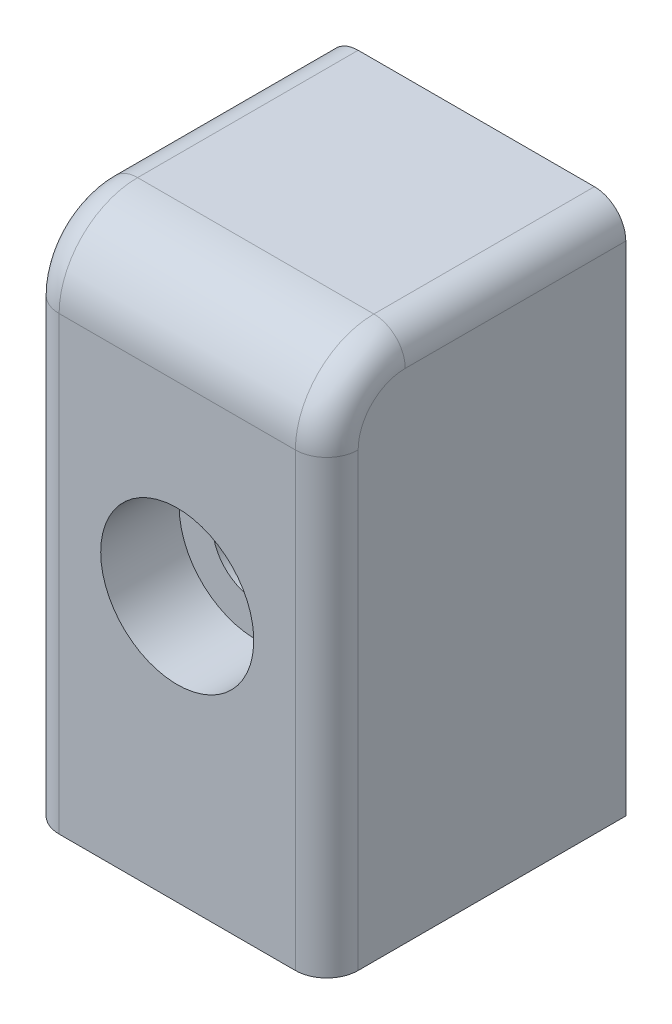
ISO-10303-21;
HEADER;
FILE_DESCRIPTION(('STEP AP214'),'2;1');
FILE_NAME('part.step','',(''),(''),'','','');
FILE_SCHEMA(('AUTOMOTIVE_DESIGN { 1 0 10303 214 1 1 1 1 }'));
ENDSEC;
DATA;
#1=APPLICATION_CONTEXT('core data for automotive mechanical design processes');
#2=APPLICATION_PROTOCOL_DEFINITION('international standard','automotive_design',2000,#1);
#3=PRODUCT_CONTEXT('',#1,'mechanical');
#4=PRODUCT('Part','Part','',(#3));
#5=PRODUCT_RELATED_PRODUCT_CATEGORY('part','',(#4));
#6=PRODUCT_DEFINITION_FORMATION('','',#4);
#7=PRODUCT_DEFINITION_CONTEXT('part definition',#1,'design');
#8=PRODUCT_DEFINITION('design','',#6,#7);
#9=PRODUCT_DEFINITION_SHAPE('','',#8);
#10=(LENGTH_UNIT() NAMED_UNIT(*) SI_UNIT(.MILLI.,.METRE.));
#11=(NAMED_UNIT(*) PLANE_ANGLE_UNIT() SI_UNIT($,.RADIAN.));
#12=(NAMED_UNIT(*) SI_UNIT($,.STERADIAN.) SOLID_ANGLE_UNIT());
#13=UNCERTAINTY_MEASURE_WITH_UNIT(LENGTH_MEASURE(1.E-05),#10,'distance_accuracy_value','');
#14=(GEOMETRIC_REPRESENTATION_CONTEXT(3) GLOBAL_UNCERTAINTY_ASSIGNED_CONTEXT((#13)) GLOBAL_UNIT_ASSIGNED_CONTEXT((#10,
#11,#12)) REPRESENTATION_CONTEXT('',''));
#15=CARTESIAN_POINT('',(0.,0.,0.));
#16=DIRECTION('',(0.,0.,1.));
#17=DIRECTION('',(1.,0.,0.));
#18=AXIS2_PLACEMENT_3D('',#15,#16,#17);
#19=CARTESIAN_POINT('',(276.487457350126,52.72,7.9993613968678));
#20=DIRECTION('',(0.,1.,0.));
#21=DIRECTION('',(1.,0.,0.));
#22=AXIS2_PLACEMENT_3D('',#19,#20,#21);
#23=PLANE('',#22);
#24=DIRECTION('',(0.,0.,1.));
#25=VECTOR('',#24,1.);
#26=CARTESIAN_POINT('',(284.012457350126,52.72,12.7618613968678));
#27=LINE('',#26,#25);
#28=CARTESIAN_POINT('',(284.012457350126,52.72,-1.5256386031322));
#29=VERTEX_POINT('',#28);
#30=CARTESIAN_POINT('',(284.012457350126,52.72,12.5243613968678));
#31=VERTEX_POINT('',#30);
#32=EDGE_CURVE('E169',#29,#31,#27,.T.);
#33=ORIENTED_EDGE('',*,*,#32,.F.);
#34=DIRECTION('',(-1.,0.,0.));
#35=VECTOR('',#34,1.);
#36=CARTESIAN_POINT('',(266.962457350126,52.72,-1.5256386031322));
#37=LINE('',#36,#35);
#38=CARTESIAN_POINT('',(268.962457350126,52.72,-1.5256386031322));
#39=VERTEX_POINT('',#38);
#40=EDGE_CURVE('E210',#29,#39,#37,.T.);
#41=ORIENTED_EDGE('',*,*,#40,.T.);
#42=DIRECTION('',(0.,0.,-1.));
#43=VECTOR('',#42,1.);
#44=CARTESIAN_POINT('',(268.962457350126,52.72,3.2368613968678));
#45=LINE('',#44,#43);
#46=CARTESIAN_POINT('',(268.962457350126,52.72,12.5243613968678));
#47=VERTEX_POINT('',#46);
#48=EDGE_CURVE('E197',#47,#39,#45,.T.);
#49=ORIENTED_EDGE('',*,*,#48,.F.);
#50=DIRECTION('',(-1.,0.,0.));
#51=VECTOR('',#50,1.);
#52=CARTESIAN_POINT('',(271.724957350126,52.72,12.5243613968678));
#53=LINE('',#52,#51);
#54=EDGE_CURVE('E186',#31,#47,#53,.T.);
#55=ORIENTED_EDGE('',*,*,#54,.F.);
#56=EDGE_LOOP('',(#33,#41,#49,#55));
#57=FACE_BOUND('',#56,.T.);
#58=ADVANCED_FACE('F17',(#57),#23,.T.);
#59=CARTESIAN_POINT('',(266.962457350126,0.,-1.5256386031322));
#60=DIRECTION('',(-1.,0.,0.));
#61=DIRECTION('',(0.,0.,1.));
#62=AXIS2_PLACEMENT_3D('',#59,#60,#61);
#63=PLANE('',#62);
#64=DIRECTION('',(0.,0.,1.));
#65=VECTOR('',#64,1.);
#66=CARTESIAN_POINT('',(266.962457350126,19.,3.2368613968678));
#67=LINE('',#66,#65);
#68=CARTESIAN_POINT('',(266.962457350126,19.,-1.5256386031322));
#69=VERTEX_POINT('',#68);
#70=CARTESIAN_POINT('',(266.962457350126,19.,15.5243613968678));
#71=VERTEX_POINT('',#70);
#72=EDGE_CURVE('E239',#69,#71,#67,.T.);
#73=ORIENTED_EDGE('',*,*,#72,.T.);
#74=DIRECTION('',(0.,-1.,0.));
#75=VECTOR('',#74,1.);
#76=CARTESIAN_POINT('',(266.962457350126,0.,15.5243613968678));
#77=LINE('',#76,#75);
#78=CARTESIAN_POINT('',(266.962457350126,47.72,15.5243613968678));
#79=VERTEX_POINT('',#78);
#80=EDGE_CURVE('E147',#79,#71,#77,.T.);
#81=ORIENTED_EDGE('',*,*,#80,.F.);
#82=CARTESIAN_POINT('',(266.962457350126,47.72,12.5243613968678));
#83=DIRECTION('',(1.,0.,0.));
#84=DIRECTION('',(0.,0.707106781186548,0.707106781186547));
#85=AXIS2_PLACEMENT_3D('',#82,#83,#84);
#86=CIRCLE('',#85,3.);
#87=CARTESIAN_POINT('',(266.962457350126,50.72,12.5243613968678));
#88=VERTEX_POINT('',#87);
#89=EDGE_CURVE('E176',#88,#79,#86,.T.);
#90=ORIENTED_EDGE('',*,*,#89,.F.);
#91=DIRECTION('',(0.,0.,1.));
#92=VECTOR('',#91,1.);
#93=CARTESIAN_POINT('',(266.962457350126,50.72,3.2368613968678));
#94=LINE('',#93,#92);
#95=CARTESIAN_POINT('',(266.962457350126,50.72,-1.5256386031322));
#96=VERTEX_POINT('',#95);
#97=EDGE_CURVE('E192',#96,#88,#94,.T.);
#98=ORIENTED_EDGE('',*,*,#97,.F.);
#99=DIRECTION('',(0.,1.,0.));
#100=VECTOR('',#99,1.);
#101=CARTESIAN_POINT('',(266.962457350126,0.,-1.5256386031322));
#102=LINE('',#101,#100);
#103=EDGE_CURVE('E204',#69,#96,#102,.T.);
#104=ORIENTED_EDGE('',*,*,#103,.F.);
#105=EDGE_LOOP('',(#73,#81,#90,#98,#104));
#106=FACE_BOUND('',#105,.T.);
#107=ADVANCED_FACE('F19',(#106),#63,.T.);
#108=CARTESIAN_POINT('',(276.487457350126,35.885,7.9993613968678));
#109=DIRECTION('',(0.,0.,-1.));
#110=DIRECTION('',(1.,0.,0.));
#111=AXIS2_PLACEMENT_3D('',#108,#109,#110);
#112=CYLINDRICAL_SURFACE('',#111,2.75);
#113=CARTESIAN_POINT('',(276.487457350126,35.885,12.5243613968678));
#114=DIRECTION('',(0.,0.,-1.));
#115=DIRECTION('',(1.,0.,0.));
#116=AXIS2_PLACEMENT_3D('',#113,#114,#115);
#117=CIRCLE('',#116,2.75);
#118=CARTESIAN_POINT('',(273.737457350126,35.885,12.5243613968678));
#119=VERTEX_POINT('',#118);
#120=EDGE_CURVE('E128',#119,#119,#117,.T.);
#121=ORIENTED_EDGE('',*,*,#120,.F.);
#122=DIRECTION('',(0.,0.,-1.));
#123=VECTOR('',#122,1.);
#124=CARTESIAN_POINT('',(273.737457350126,35.885,7.9993613968678));
#125=LINE('',#124,#123);
#126=CARTESIAN_POINT('',(273.737457350126,35.885,-1.5256386031322));
#127=VERTEX_POINT('',#126);
#128=EDGE_CURVE('E11',#119,#127,#125,.T.);
#129=ORIENTED_EDGE('',*,*,#128,.T.);
#130=CARTESIAN_POINT('',(276.487457350126,35.885,-1.5256386031322));
#131=DIRECTION('',(0.,0.,1.));
#132=DIRECTION('',(1.,0.,0.));
#133=AXIS2_PLACEMENT_3D('',#130,#131,#132);
#134=CIRCLE('',#133,2.75);
#135=EDGE_CURVE('E207',#127,#127,#134,.T.);
#136=ORIENTED_EDGE('',*,*,#135,.F.);
#137=ORIENTED_EDGE('',*,*,#128,.F.);
#138=EDGE_LOOP('',(#121,#129,#136,#137));
#139=FACE_BOUND('',#138,.T.);
#140=ADVANCED_FACE('F222',(#139),#112,.F.);
#141=CARTESIAN_POINT('',(276.487457350126,35.885,15.0243613968678));
#142=DIRECTION('',(0.,0.,-1.));
#143=DIRECTION('',(1.,0.,0.));
#144=AXIS2_PLACEMENT_3D('',#141,#142,#143);
#145=CYLINDRICAL_SURFACE('',#144,4.875);
#146=CARTESIAN_POINT('',(276.487457350126,35.885,17.5243613968678));
#147=DIRECTION('',(0.,0.,-1.));
#148=DIRECTION('',(1.,0.,0.));
#149=AXIS2_PLACEMENT_3D('',#146,#147,#148);
#150=CIRCLE('',#149,4.875);
#151=CARTESIAN_POINT('',(271.612457350126,35.885,17.5243613968678));
#152=VERTEX_POINT('',#151);
#153=EDGE_CURVE('E122',#152,#152,#150,.T.);
#154=ORIENTED_EDGE('',*,*,#153,.F.);
#155=DIRECTION('',(0.,0.,-1.));
#156=VECTOR('',#155,1.);
#157=CARTESIAN_POINT('',(271.612457350126,35.885,15.0243613968678));
#158=LINE('',#157,#156);
#159=CARTESIAN_POINT('',(271.612457350126,35.885,12.5243613968678));
#160=VERTEX_POINT('',#159);
#161=EDGE_CURVE('E30',#152,#160,#158,.T.);
#162=ORIENTED_EDGE('',*,*,#161,.T.);
#163=CARTESIAN_POINT('',(276.487457350126,35.885,12.5243613968678));
#164=DIRECTION('',(0.,0.,-1.));
#165=DIRECTION('',(1.,0.,0.));
#166=AXIS2_PLACEMENT_3D('',#163,#164,#165);
#167=CIRCLE('',#166,4.875);
#168=EDGE_CURVE('E130',#160,#160,#167,.T.);
#169=ORIENTED_EDGE('',*,*,#168,.T.);
#170=ORIENTED_EDGE('',*,*,#161,.F.);
#171=EDGE_LOOP('',(#154,#162,#169,#170));
#172=FACE_BOUND('',#171,.T.);
#173=ADVANCED_FACE('F123',(#172),#145,.F.);
#174=CARTESIAN_POINT('',(276.487457350126,35.885,12.5243613968678));
#175=DIRECTION('',(0.,0.,-1.));
#176=DIRECTION('',(0.,-1.,0.));
#177=AXIS2_PLACEMENT_3D('',#174,#175,#176);
#178=PLANE('',#177);
#179=ORIENTED_EDGE('',*,*,#120,.T.);
#180=EDGE_LOOP('',(#179));
#181=FACE_BOUND('',#180,.T.);
#182=ORIENTED_EDGE('',*,*,#168,.F.);
#183=EDGE_LOOP('',(#182));
#184=FACE_BOUND('',#183,.T.);
#185=ADVANCED_FACE('F218',(#181,#184),#178,.F.);
#186=CARTESIAN_POINT('',(286.012457350126,0.,-1.5256386031322));
#187=DIRECTION('',(0.,0.,-1.));
#188=DIRECTION('',(0.,-1.,0.));
#189=AXIS2_PLACEMENT_3D('',#186,#187,#188);
#190=PLANE('',#189);
#191=ORIENTED_EDGE('',*,*,#135,.T.);
#192=EDGE_LOOP('',(#191));
#193=FACE_BOUND('',#192,.T.);
#194=DIRECTION('',(-1.,0.,0.));
#195=VECTOR('',#194,1.);
#196=CARTESIAN_POINT('',(281.249957350126,19.,-1.5256386031322));
#197=LINE('',#196,#195);
#198=CARTESIAN_POINT('',(286.012457350126,19.,-1.5256386031322));
#199=VERTEX_POINT('',#198);
#200=EDGE_CURVE('E230',#199,#69,#197,.T.);
#201=ORIENTED_EDGE('',*,*,#200,.T.);
#202=ORIENTED_EDGE('',*,*,#103,.T.);
#203=CARTESIAN_POINT('',(268.962457350126,50.72,-1.5256386031322));
#204=DIRECTION('',(0.,0.,1.));
#205=DIRECTION('',(-0.707106781186538,0.707106781186557,0.));
#206=AXIS2_PLACEMENT_3D('',#203,#204,#205);
#207=CIRCLE('',#206,2.);
#208=EDGE_CURVE('E189',#39,#96,#207,.T.);
#209=ORIENTED_EDGE('',*,*,#208,.F.);
#210=ORIENTED_EDGE('',*,*,#40,.F.);
#211=CARTESIAN_POINT('',(284.012457350126,50.72,-1.5256386031322));
#212=DIRECTION('',(0.,0.,1.));
#213=DIRECTION('',(0.707106781186538,0.707106781186557,0.));
#214=AXIS2_PLACEMENT_3D('',#211,#212,#213);
#215=CIRCLE('',#214,2.);
#216=CARTESIAN_POINT('',(286.012457350126,50.72,-1.5256386031322));
#217=VERTEX_POINT('',#216);
#218=EDGE_CURVE('E163',#217,#29,#215,.T.);
#219=ORIENTED_EDGE('',*,*,#218,.F.);
#220=DIRECTION('',(0.,1.,0.));
#221=VECTOR('',#220,1.);
#222=CARTESIAN_POINT('',(286.012457350126,0.,-1.5256386031322));
#223=LINE('',#222,#221);
#224=EDGE_CURVE('E203',#199,#217,#223,.T.);
#225=ORIENTED_EDGE('',*,*,#224,.F.);
#226=EDGE_LOOP('',(#201,#202,#209,#210,#219,#225));
#227=FACE_BOUND('',#226,.T.);
#228=ADVANCED_FACE('F224',(#193,#227),#190,.T.);
#229=CARTESIAN_POINT('',(286.012457350126,0.,17.5243613968678));
#230=DIRECTION('',(1.,0.,0.));
#231=DIRECTION('',(0.,1.,0.));
#232=AXIS2_PLACEMENT_3D('',#229,#230,#231);
#233=PLANE('',#232);
#234=DIRECTION('',(0.,0.,-1.));
#235=VECTOR('',#234,1.);
#236=CARTESIAN_POINT('',(286.012457350126,19.,12.7618613968678));
#237=LINE('',#236,#235);
#238=CARTESIAN_POINT('',(286.012457350126,19.,15.5243613968678));
#239=VERTEX_POINT('',#238);
#240=EDGE_CURVE('E237',#239,#199,#237,.T.);
#241=ORIENTED_EDGE('',*,*,#240,.T.);
#242=ORIENTED_EDGE('',*,*,#224,.T.);
#243=DIRECTION('',(0.,0.,-1.));
#244=VECTOR('',#243,1.);
#245=CARTESIAN_POINT('',(286.012457350126,50.72,12.7618613968678));
#246=LINE('',#245,#244);
#247=CARTESIAN_POINT('',(286.012457350126,50.72,12.5243613968678));
#248=VERTEX_POINT('',#247);
#249=EDGE_CURVE('E172',#248,#217,#246,.T.);
#250=ORIENTED_EDGE('',*,*,#249,.F.);
#251=CARTESIAN_POINT('',(286.012457350126,47.72,12.5243613968678));
#252=DIRECTION('',(-1.,0.,0.));
#253=DIRECTION('',(0.,0.707106781186548,0.707106781186547));
#254=AXIS2_PLACEMENT_3D('',#251,#252,#253);
#255=CIRCLE('',#254,3.);
#256=CARTESIAN_POINT('',(286.012457350126,47.72,15.5243613968678));
#257=VERTEX_POINT('',#256);
#258=EDGE_CURVE('E154',#257,#248,#255,.T.);
#259=ORIENTED_EDGE('',*,*,#258,.F.);
#260=DIRECTION('',(0.,1.,0.));
#261=VECTOR('',#260,1.);
#262=CARTESIAN_POINT('',(286.012457350126,0.,15.5243613968678));
#263=LINE('',#262,#261);
#264=EDGE_CURVE('E133',#239,#257,#263,.T.);
#265=ORIENTED_EDGE('',*,*,#264,.F.);
#266=EDGE_LOOP('',(#241,#242,#250,#259,#265));
#267=FACE_BOUND('',#266,.T.);
#268=ADVANCED_FACE('F226',(#267),#233,.T.);
#269=CARTESIAN_POINT('',(268.962457350126,50.72,3.2368613968678));
#270=DIRECTION('',(0.,0.,1.));
#271=DIRECTION('',(-0.707106781186538,0.707106781186557,0.));
#272=AXIS2_PLACEMENT_3D('',#269,#270,#271);
#273=CYLINDRICAL_SURFACE('',#272,2.);
#274=ORIENTED_EDGE('',*,*,#208,.T.);
#275=ORIENTED_EDGE('',*,*,#97,.T.);
#276=CARTESIAN_POINT('',(268.962457350126,50.72,12.5243613968678));
#277=DIRECTION('',(0.,0.,-1.));
#278=DIRECTION('',(-1.,0.,0.));
#279=AXIS2_PLACEMENT_3D('',#276,#277,#278);
#280=CIRCLE('',#279,2.);
#281=EDGE_CURVE('E181',#88,#47,#280,.T.);
#282=ORIENTED_EDGE('',*,*,#281,.T.);
#283=ORIENTED_EDGE('',*,*,#48,.T.);
#284=EDGE_LOOP('',(#274,#275,#282,#283));
#285=FACE_BOUND('',#284,.T.);
#286=ADVANCED_FACE('F338',(#285),#273,.T.);
#287=CARTESIAN_POINT('',(271.724957350126,47.72,12.5243613968678));
#288=DIRECTION('',(1.,0.,0.));
#289=DIRECTION('',(0.,0.707106781186548,0.707106781186548));
#290=AXIS2_PLACEMENT_3D('',#287,#288,#289);
#291=CYLINDRICAL_SURFACE('',#290,5.);
#292=CARTESIAN_POINT('',(284.012457350126,47.72,12.5243613968678));
#293=DIRECTION('',(-1.,0.,0.));
#294=DIRECTION('',(0.,0.,1.));
#295=AXIS2_PLACEMENT_3D('',#292,#293,#294);
#296=CIRCLE('',#295,5.);
#297=CARTESIAN_POINT('',(284.012457350126,47.72,17.5243613968678));
#298=VERTEX_POINT('',#297);
#299=EDGE_CURVE('E155',#298,#31,#296,.T.);
#300=ORIENTED_EDGE('',*,*,#299,.T.);
#301=ORIENTED_EDGE('',*,*,#54,.T.);
#302=CARTESIAN_POINT('',(268.962457350126,47.72,12.5243613968678));
#303=DIRECTION('',(1.,0.,0.));
#304=DIRECTION('',(0.,1.,0.));
#305=AXIS2_PLACEMENT_3D('',#302,#303,#304);
#306=CIRCLE('',#305,5.);
#307=CARTESIAN_POINT('',(268.962457350126,47.72,17.5243613968678));
#308=VERTEX_POINT('',#307);
#309=EDGE_CURVE('E177',#47,#308,#306,.T.);
#310=ORIENTED_EDGE('',*,*,#309,.T.);
#311=DIRECTION('',(1.,0.,0.));
#312=VECTOR('',#311,1.);
#313=CARTESIAN_POINT('',(271.724957350126,47.72,17.5243613968678));
#314=LINE('',#313,#312);
#315=EDGE_CURVE('E134',#308,#298,#314,.T.);
#316=ORIENTED_EDGE('',*,*,#315,.T.);
#317=EDGE_LOOP('',(#300,#301,#310,#316));
#318=FACE_BOUND('',#317,.T.);
#319=ADVANCED_FACE('F333',(#318),#291,.T.);
#320=CARTESIAN_POINT('',(268.962457350126,47.72,12.5243613968678));
#321=DIRECTION('',(1.,0.,0.));
#322=DIRECTION('',(0.,0.,-1.));
#323=AXIS2_PLACEMENT_3D('',#320,#321,#322);
#324=TOROIDAL_SURFACE('',#323,3.,2.);
#325=ORIENTED_EDGE('',*,*,#89,.T.);
#326=CARTESIAN_POINT('',(268.962457350126,47.72,15.5243613968678));
#327=DIRECTION('',(0.,-1.,0.));
#328=DIRECTION('',(0.,0.,1.));
#329=AXIS2_PLACEMENT_3D('',#326,#327,#328);
#330=CIRCLE('',#329,2.);
#331=EDGE_CURVE('E270',#308,#79,#330,.T.);
#332=ORIENTED_EDGE('',*,*,#331,.F.);
#333=ORIENTED_EDGE('',*,*,#309,.F.);
#334=ORIENTED_EDGE('',*,*,#281,.F.);
#335=EDGE_LOOP('',(#325,#332,#333,#334));
#336=FACE_BOUND('',#335,.T.);
#337=ADVANCED_FACE('F284',(#336),#324,.T.);
#338=CARTESIAN_POINT('',(284.012457350126,50.72,12.7618613968678));
#339=DIRECTION('',(0.,0.,-1.));
#340=DIRECTION('',(0.707106781186538,0.707106781186557,0.));
#341=AXIS2_PLACEMENT_3D('',#338,#339,#340);
#342=CYLINDRICAL_SURFACE('',#341,2.);
#343=ORIENTED_EDGE('',*,*,#218,.T.);
#344=ORIENTED_EDGE('',*,*,#32,.T.);
#345=CARTESIAN_POINT('',(284.012457350126,50.72,12.5243613968678));
#346=DIRECTION('',(0.,0.,-1.));
#347=DIRECTION('',(0.,1.,0.));
#348=AXIS2_PLACEMENT_3D('',#345,#346,#347);
#349=CIRCLE('',#348,2.);
#350=EDGE_CURVE('E159',#31,#248,#349,.T.);
#351=ORIENTED_EDGE('',*,*,#350,.T.);
#352=ORIENTED_EDGE('',*,*,#249,.T.);
#353=EDGE_LOOP('',(#343,#344,#351,#352));
#354=FACE_BOUND('',#353,.T.);
#355=ADVANCED_FACE('F341',(#354),#342,.T.);
#356=CARTESIAN_POINT('',(284.012457350126,47.72,12.5243613968678));
#357=DIRECTION('',(1.,0.,0.));
#358=DIRECTION('',(0.,0.,-1.));
#359=AXIS2_PLACEMENT_3D('',#356,#357,#358);
#360=TOROIDAL_SURFACE('',#359,3.,2.);
#361=ORIENTED_EDGE('',*,*,#299,.F.);
#362=CARTESIAN_POINT('',(284.012457350126,47.72,15.5243613968678));
#363=DIRECTION('',(0.,-1.,0.));
#364=DIRECTION('',(1.,0.,0.));
#365=AXIS2_PLACEMENT_3D('',#362,#363,#364);
#366=CIRCLE('',#365,2.);
#367=EDGE_CURVE('E141',#257,#298,#366,.T.);
#368=ORIENTED_EDGE('',*,*,#367,.F.);
#369=ORIENTED_EDGE('',*,*,#258,.T.);
#370=ORIENTED_EDGE('',*,*,#350,.F.);
#371=EDGE_LOOP('',(#361,#368,#369,#370));
#372=FACE_BOUND('',#371,.T.);
#373=ADVANCED_FACE('F331',(#372),#360,.T.);
#374=CARTESIAN_POINT('',(284.012457350126,0.,15.5243613968678));
#375=DIRECTION('',(0.,1.,0.));
#376=DIRECTION('',(0.70710678118654,0.,0.707106781186555));
#377=AXIS2_PLACEMENT_3D('',#374,#375,#376);
#378=CYLINDRICAL_SURFACE('',#377,2.);
#379=CARTESIAN_POINT('',(284.012457350126,19.,15.5243613968678));
#380=DIRECTION('',(0.,1.,0.));
#381=DIRECTION('',(0.70710678118654,0.,0.707106781186555));
#382=AXIS2_PLACEMENT_3D('',#379,#380,#381);
#383=CIRCLE('',#382,2.);
#384=CARTESIAN_POINT('',(284.012457350126,19.,17.5243613968678));
#385=VERTEX_POINT('',#384);
#386=EDGE_CURVE('E319',#385,#239,#383,.T.);
#387=ORIENTED_EDGE('',*,*,#386,.T.);
#388=ORIENTED_EDGE('',*,*,#264,.T.);
#389=ORIENTED_EDGE('',*,*,#367,.T.);
#390=DIRECTION('',(0.,-1.,0.));
#391=VECTOR('',#390,1.);
#392=CARTESIAN_POINT('',(284.012457350126,0.,17.5243613968678));
#393=LINE('',#392,#391);
#394=EDGE_CURVE('E148',#298,#385,#393,.T.);
#395=ORIENTED_EDGE('',*,*,#394,.T.);
#396=EDGE_LOOP('',(#387,#388,#389,#395));
#397=FACE_BOUND('',#396,.T.);
#398=ADVANCED_FACE('F328',(#397),#378,.T.);
#399=CARTESIAN_POINT('',(266.962457350126,0.,17.5243613968678));
#400=DIRECTION('',(0.,0.,1.));
#401=DIRECTION('',(1.,0.,0.));
#402=AXIS2_PLACEMENT_3D('',#399,#400,#401);
#403=PLANE('',#402);
#404=ORIENTED_EDGE('',*,*,#153,.T.);
#405=EDGE_LOOP('',(#404));
#406=FACE_BOUND('',#405,.T.);
#407=DIRECTION('',(1.,0.,0.));
#408=VECTOR('',#407,1.);
#409=CARTESIAN_POINT('',(271.724957350126,19.,17.5243613968678));
#410=LINE('',#409,#408);
#411=CARTESIAN_POINT('',(268.962457350126,19.,17.5243613968678));
#412=VERTEX_POINT('',#411);
#413=EDGE_CURVE('E258',#412,#385,#410,.T.);
#414=ORIENTED_EDGE('',*,*,#413,.T.);
#415=ORIENTED_EDGE('',*,*,#394,.F.);
#416=ORIENTED_EDGE('',*,*,#315,.F.);
#417=DIRECTION('',(0.,1.,0.));
#418=VECTOR('',#417,1.);
#419=CARTESIAN_POINT('',(268.962457350126,0.,17.5243613968678));
#420=LINE('',#419,#418);
#421=EDGE_CURVE('E263',#412,#308,#420,.T.);
#422=ORIENTED_EDGE('',*,*,#421,.F.);
#423=EDGE_LOOP('',(#414,#415,#416,#422));
#424=FACE_BOUND('',#423,.T.);
#425=ADVANCED_FACE('F131',(#406,#424),#403,.T.);
#426=CARTESIAN_POINT('',(268.962457350126,0.,15.5243613968678));
#427=DIRECTION('',(0.,1.,0.));
#428=DIRECTION('',(-0.707106781186552,0.,0.707106781186543));
#429=AXIS2_PLACEMENT_3D('',#426,#427,#428);
#430=CYLINDRICAL_SURFACE('',#429,2.);
#431=CARTESIAN_POINT('',(268.962457350126,19.,15.5243613968678));
#432=DIRECTION('',(0.,1.,0.));
#433=DIRECTION('',(-0.707106781186552,0.,0.707106781186543));
#434=AXIS2_PLACEMENT_3D('',#431,#432,#433);
#435=CIRCLE('',#434,2.);
#436=EDGE_CURVE('E248',#71,#412,#435,.T.);
#437=ORIENTED_EDGE('',*,*,#436,.T.);
#438=ORIENTED_EDGE('',*,*,#421,.T.);
#439=ORIENTED_EDGE('',*,*,#331,.T.);
#440=ORIENTED_EDGE('',*,*,#80,.T.);
#441=EDGE_LOOP('',(#437,#438,#439,#440));
#442=FACE_BOUND('',#441,.T.);
#443=ADVANCED_FACE('F274',(#442),#430,.T.);
#444=CARTESIAN_POINT('',(276.487457350126,19.,7.9993613968678));
#445=DIRECTION('',(0.,1.,0.));
#446=DIRECTION('',(1.,0.,0.));
#447=AXIS2_PLACEMENT_3D('',#444,#445,#446);
#448=PLANE('',#447);
#449=ORIENTED_EDGE('',*,*,#386,.F.);
#450=ORIENTED_EDGE('',*,*,#413,.F.);
#451=ORIENTED_EDGE('',*,*,#436,.F.);
#452=ORIENTED_EDGE('',*,*,#72,.F.);
#453=ORIENTED_EDGE('',*,*,#200,.F.);
#454=ORIENTED_EDGE('',*,*,#240,.F.);
#455=EDGE_LOOP('',(#449,#450,#451,#452,#453,#454));
#456=FACE_BOUND('',#455,.T.);
#457=ADVANCED_FACE('F244',(#456),#448,.F.);
#458=CLOSED_SHELL('',(#58,#107,#140,#173,#185,#228,#268,#286,#319,#337,#355,#373,#398,#425,#443,#457));
#459=MANIFOLD_SOLID_BREP('B1',#458);
#460=ADVANCED_BREP_SHAPE_REPRESENTATION('',(#18,#459),#14);
#461=SHAPE_DEFINITION_REPRESENTATION(#9,#460);
ENDSEC;
END-ISO-10303-21;
